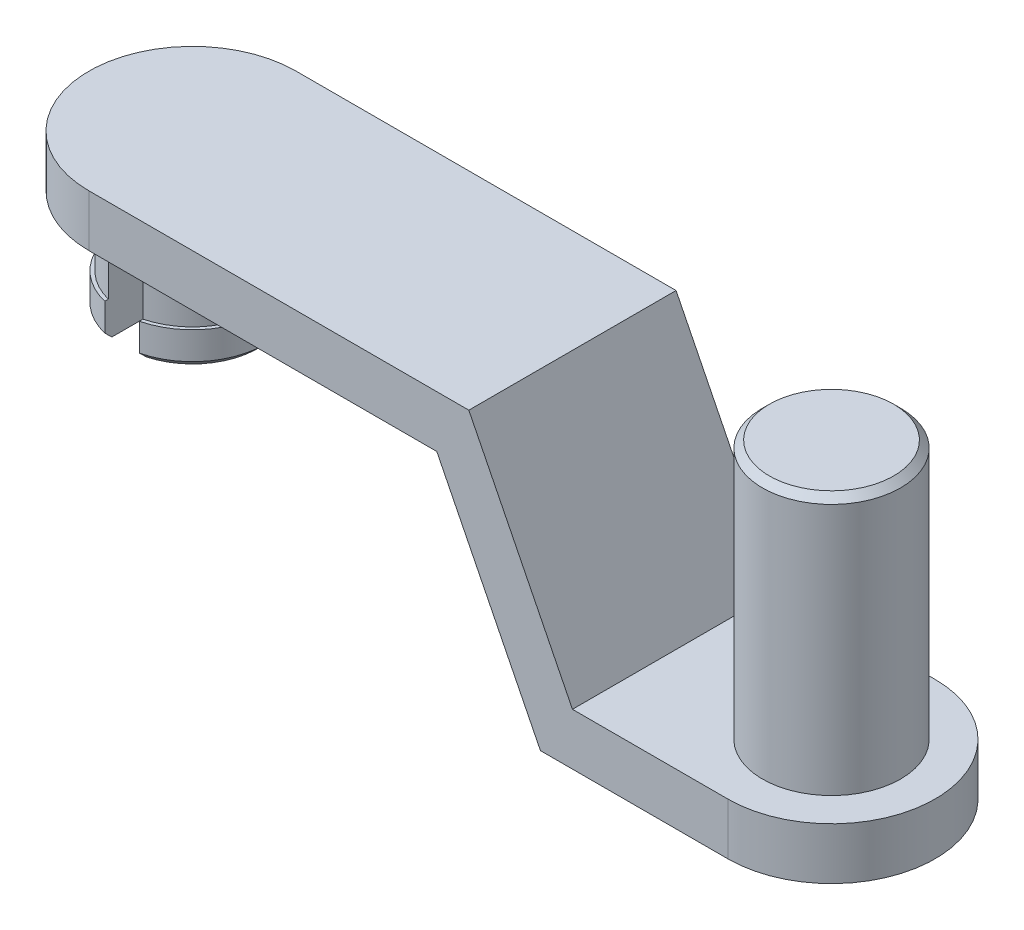
ISO-10303-21;
HEADER;
FILE_DESCRIPTION(('STEP AP214'),'2;1');
FILE_NAME('part.step','',(''),(''),'','','');
FILE_SCHEMA(('AUTOMOTIVE_DESIGN { 1 0 10303 214 1 1 1 1 }'));
ENDSEC;
DATA;
#1=APPLICATION_CONTEXT('core data for automotive mechanical design processes');
#2=APPLICATION_PROTOCOL_DEFINITION('international standard','automotive_design',2000,#1);
#3=PRODUCT_CONTEXT('',#1,'mechanical');
#4=PRODUCT('Part','Part','',(#3));
#5=PRODUCT_RELATED_PRODUCT_CATEGORY('part','',(#4));
#6=PRODUCT_DEFINITION_FORMATION('','',#4);
#7=PRODUCT_DEFINITION_CONTEXT('part definition',#1,'design');
#8=PRODUCT_DEFINITION('design','',#6,#7);
#9=PRODUCT_DEFINITION_SHAPE('','',#8);
#10=(LENGTH_UNIT() NAMED_UNIT(*) SI_UNIT(.MILLI.,.METRE.));
#11=(NAMED_UNIT(*) PLANE_ANGLE_UNIT() SI_UNIT($,.RADIAN.));
#12=(NAMED_UNIT(*) SI_UNIT($,.STERADIAN.) SOLID_ANGLE_UNIT());
#13=UNCERTAINTY_MEASURE_WITH_UNIT(LENGTH_MEASURE(1.E-05),#10,'distance_accuracy_value','');
#14=(GEOMETRIC_REPRESENTATION_CONTEXT(3) GLOBAL_UNCERTAINTY_ASSIGNED_CONTEXT((#13)) GLOBAL_UNIT_ASSIGNED_CONTEXT((#10,
#11,#12)) REPRESENTATION_CONTEXT('',''));
#15=CARTESIAN_POINT('',(0.,0.,0.));
#16=DIRECTION('',(0.,0.,1.));
#17=DIRECTION('',(1.,0.,0.));
#18=AXIS2_PLACEMENT_3D('',#15,#16,#17);
#19=CARTESIAN_POINT('',(14.,-6.,6.));
#20=DIRECTION('',(0.,-1.,0.));
#21=DIRECTION('',(1.,0.,0.));
#22=AXIS2_PLACEMENT_3D('',#19,#20,#21);
#23=PLANE('',#22);
#24=DIRECTION('',(-1.,0.,0.));
#25=VECTOR('',#24,1.);
#26=CARTESIAN_POINT('',(14.,-6.,6.));
#27=LINE('',#26,#25);
#28=CARTESIAN_POINT('',(18.5,-6.,6.));
#29=VERTEX_POINT('',#28);
#30=CARTESIAN_POINT('',(14.,-6.,6.));
#31=VERTEX_POINT('',#30);
#32=EDGE_CURVE('E110',#29,#31,#27,.T.);
#33=ORIENTED_EDGE('',*,*,#32,.F.);
#34=CARTESIAN_POINT('',(18.5,-6.,3.));
#35=DIRECTION('',(0.,1.,0.));
#36=DIRECTION('',(-1.,0.,0.));
#37=AXIS2_PLACEMENT_3D('',#34,#35,#36);
#38=CIRCLE('',#37,3.);
#39=CARTESIAN_POINT('',(18.5,-6.,0.));
#40=VERTEX_POINT('',#39);
#41=EDGE_CURVE('E331',#29,#40,#38,.T.);
#42=ORIENTED_EDGE('',*,*,#41,.T.);
#43=DIRECTION('',(-1.,0.,0.));
#44=VECTOR('',#43,1.);
#45=CARTESIAN_POINT('',(14.,-6.,0.));
#46=LINE('',#45,#44);
#47=CARTESIAN_POINT('',(14.,-6.,0.));
#48=VERTEX_POINT('',#47);
#49=EDGE_CURVE('E126',#40,#48,#46,.T.);
#50=ORIENTED_EDGE('',*,*,#49,.T.);
#51=DIRECTION('',(0.,0.,-1.));
#52=VECTOR('',#51,1.);
#53=CARTESIAN_POINT('',(14.,-6.,6.));
#54=LINE('',#53,#52);
#55=EDGE_CURVE('E123',#31,#48,#54,.T.);
#56=ORIENTED_EDGE('',*,*,#55,.F.);
#57=EDGE_LOOP('',(#33,#42,#50,#56));
#58=FACE_BOUND('',#57,.T.);
#59=CARTESIAN_POINT('',(18.5,-6.,3.));
#60=DIRECTION('',(0.,-1.,0.));
#61=DIRECTION('',(1.,0.,0.));
#62=AXIS2_PLACEMENT_3D('',#59,#60,#61);
#63=CIRCLE('',#62,2.);
#64=CARTESIAN_POINT('',(20.5,-6.,3.));
#65=VERTEX_POINT('',#64);
#66=EDGE_CURVE('E416',#65,#65,#63,.F.);
#67=ORIENTED_EDGE('',*,*,#66,.F.);
#68=EDGE_LOOP('',(#67));
#69=FACE_BOUND('',#68,.T.);
#70=ADVANCED_FACE('F34',(#58,#69),#23,.F.);
#71=CARTESIAN_POINT('',(0.,-3.5,3.));
#72=DIRECTION('',(0.,-1.,0.));
#73=DIRECTION('',(0.,0.,-1.));
#74=AXIS2_PLACEMENT_3D('',#71,#72,#73);
#75=PLANE('',#74);
#76=CARTESIAN_POINT('',(0.,-3.5,3.));
#77=DIRECTION('',(0.,-1.,0.));
#78=DIRECTION('',(0.,0.,-1.));
#79=AXIS2_PLACEMENT_3D('',#76,#77,#78);
#80=CIRCLE('',#79,2.1);
#81=CARTESIAN_POINT('',(0.5,-3.5,0.960392194562886));
#82=VERTEX_POINT('',#81);
#83=CARTESIAN_POINT('',(0.5,-3.5,5.03960780543711));
#84=VERTEX_POINT('',#83);
#85=EDGE_CURVE('E324',#82,#84,#80,.T.);
#86=ORIENTED_EDGE('',*,*,#85,.F.);
#87=DIRECTION('',(0.,0.,1.));
#88=VECTOR('',#87,1.);
#89=CARTESIAN_POINT('',(0.5,-3.5,3.));
#90=LINE('',#89,#88);
#91=CARTESIAN_POINT('',(0.5,-3.5,1.06350832689629));
#92=VERTEX_POINT('',#91);
#93=EDGE_CURVE('E315',#82,#92,#90,.T.);
#94=ORIENTED_EDGE('',*,*,#93,.T.);
#95=CARTESIAN_POINT('',(0.,-3.5,3.));
#96=DIRECTION('',(0.,-1.,0.));
#97=DIRECTION('',(0.,0.,-1.));
#98=AXIS2_PLACEMENT_3D('',#95,#96,#97);
#99=CIRCLE('',#98,2.);
#100=CARTESIAN_POINT('',(0.5,-3.5,4.93649167310371));
#101=VERTEX_POINT('',#100);
#102=EDGE_CURVE('E328',#92,#101,#99,.T.);
#103=ORIENTED_EDGE('',*,*,#102,.T.);
#104=EDGE_CURVE('E311',#101,#84,#90,.T.);
#105=ORIENTED_EDGE('',*,*,#104,.T.);
#106=EDGE_LOOP('',(#86,#94,#103,#105));
#107=FACE_BOUND('',#106,.T.);
#108=ADVANCED_FACE('F207',(#107),#75,.F.);
#109=CARTESIAN_POINT('',(0.,-4.5,3.));
#110=DIRECTION('',(0.,1.,0.));
#111=DIRECTION('',(0.,0.,1.));
#112=AXIS2_PLACEMENT_3D('',#109,#110,#111);
#113=CYLINDRICAL_SURFACE('',#112,2.1);
#114=CARTESIAN_POINT('',(0.,-4.3,3.));
#115=DIRECTION('',(0.,-1.,0.));
#116=DIRECTION('',(0.,0.,-1.));
#117=AXIS2_PLACEMENT_3D('',#114,#115,#116);
#118=CIRCLE('',#117,2.1);
#119=CARTESIAN_POINT('',(0.5,-4.3,5.03960780543711));
#120=VERTEX_POINT('',#119);
#121=CARTESIAN_POINT('',(0.5,-4.3,0.960392194562886));
#122=VERTEX_POINT('',#121);
#123=EDGE_CURVE('E168',#120,#122,#118,.F.);
#124=ORIENTED_EDGE('',*,*,#123,.T.);
#125=DIRECTION('',(0.,1.,0.));
#126=VECTOR('',#125,1.);
#127=CARTESIAN_POINT('',(0.5,-4.5,0.960392194562886));
#128=LINE('',#127,#126);
#129=EDGE_CURVE('E318',#122,#82,#128,.T.);
#130=ORIENTED_EDGE('',*,*,#129,.T.);
#131=ORIENTED_EDGE('',*,*,#85,.T.);
#132=DIRECTION('',(0.,1.,0.));
#133=VECTOR('',#132,1.);
#134=CARTESIAN_POINT('',(0.5,-4.5,5.03960780543711));
#135=LINE('',#134,#133);
#136=EDGE_CURVE('E308',#84,#120,#135,.F.);
#137=ORIENTED_EDGE('',*,*,#136,.T.);
#138=EDGE_LOOP('',(#124,#130,#131,#137));
#139=FACE_BOUND('',#138,.T.);
#140=ADVANCED_FACE('F211',(#139),#113,.T.);
#141=CARTESIAN_POINT('',(0.,-4.5,3.));
#142=DIRECTION('',(0.,-1.,0.));
#143=DIRECTION('',(0.,0.,-1.));
#144=AXIS2_PLACEMENT_3D('',#141,#142,#143);
#145=PLANE('',#144);
#146=DIRECTION('',(0.,0.,1.));
#147=VECTOR('',#146,1.);
#148=CARTESIAN_POINT('',(0.5,-4.5,5.5));
#149=LINE('',#148,#147);
#150=CARTESIAN_POINT('',(0.5,-4.5,1.16696972201766));
#151=VERTEX_POINT('',#150);
#152=CARTESIAN_POINT('',(0.5,-4.5,4.83303027798234));
#153=VERTEX_POINT('',#152);
#154=EDGE_CURVE('E299',#151,#153,#149,.T.);
#155=ORIENTED_EDGE('',*,*,#154,.F.);
#156=CARTESIAN_POINT('',(0.,-4.5,3.));
#157=DIRECTION('',(0.,-1.,0.));
#158=DIRECTION('',(0.,0.,-1.));
#159=AXIS2_PLACEMENT_3D('',#156,#157,#158);
#160=CIRCLE('',#159,1.9);
#161=EDGE_CURVE('E165',#151,#153,#160,.T.);
#162=ORIENTED_EDGE('',*,*,#161,.T.);
#163=EDGE_LOOP('',(#155,#162));
#164=FACE_BOUND('',#163,.T.);
#165=ADVANCED_FACE('F201',(#164),#145,.T.);
#166=CARTESIAN_POINT('',(0.,-4.5,3.));
#167=DIRECTION('',(0.,1.,0.));
#168=DIRECTION('',(0.,0.,1.));
#169=AXIS2_PLACEMENT_3D('',#166,#167,#168);
#170=CONICAL_SURFACE('',#169,1.9,0.785398163397446);
#171=CARTESIAN_POINT('',(0.500000000000001,-1.77694447500456,-1.59593759609405));
#172=CARTESIAN_POINT('',(0.500000000000001,-1.90725864942486,-1.464851596499));
#173=CARTESIAN_POINT('',(0.500000000000001,-2.03754284896405,-1.33373577582339));
#174=CARTESIAN_POINT('',(0.500000000000001,-2.29804470121487,-1.07139825790242));
#175=CARTESIAN_POINT('',(0.5,-2.42826234071689,-0.940176547540759));
#176=CARTESIAN_POINT('',(0.5,-2.68904147008711,-0.677160306255822));
#177=CARTESIAN_POINT('',(0.5,-2.8196025627187,-0.545365381309664));
#178=CARTESIAN_POINT('',(0.5,-3.08054503209228,-0.281637124747754));
#179=CARTESIAN_POINT('',(0.5,-3.21092643296967,-0.149703817005005));
#180=CARTESIAN_POINT('',(0.5,-3.52850486402094,0.172195926472496));
#181=CARTESIAN_POINT('',(0.5,-3.71558342952231,0.362279460615369));
#182=CARTESIAN_POINT('',(0.5,-3.99560379794718,0.648091252766742));
#183=CARTESIAN_POINT('',(0.5,-4.08886944410913,0.743502121435567));
#184=CARTESIAN_POINT('',(0.5,-4.27507790747899,0.934627554376544));
#185=CARTESIAN_POINT('',(0.5,-4.36802074378927,1.03034210001431));
#186=CARTESIAN_POINT('',(0.5,-4.55313085699641,1.22192993308691));
#187=CARTESIAN_POINT('',(0.5,-4.64529966114633,1.3178017442749));
#188=CARTESIAN_POINT('',(0.5,-4.82889767979174,1.51029609146025));
#189=CARTESIAN_POINT('',(0.5,-4.9203267212399,1.60691879330397));
#190=CARTESIAN_POINT('',(0.5,-5.05639094978187,1.75276953831258));
#191=CARTESIAN_POINT('',(0.5,-5.10154336893163,1.8015144931751));
#192=CARTESIAN_POINT('',(0.5,-5.19135742130123,1.89945387424127));
#193=CARTESIAN_POINT('',(0.5,-5.23601906525753,1.94864829056898));
#194=CARTESIAN_POINT('',(0.5,-5.32461063108871,2.04766027688098));
#195=CARTESIAN_POINT('',(0.5,-5.36854081566302,2.0974776113789));
#196=CARTESIAN_POINT('',(0.5,-5.45530168324035,2.19805811221833));
#197=CARTESIAN_POINT('',(0.5,-5.49813252655766,2.24882113876708));
#198=CARTESIAN_POINT('',(0.5,-5.55618205732116,2.32017718843945));
#199=CARTESIAN_POINT('',(0.5,-5.57218617843553,2.34012962066835));
#200=CARTESIAN_POINT('',(0.5,-5.60384526011566,2.38031034135259));
#201=CARTESIAN_POINT('',(0.5,-5.61950019910023,2.40053864673443));
#202=CARTESIAN_POINT('',(0.5,-5.6658889832682,2.46181798768515));
#203=CARTESIAN_POINT('',(0.5,-5.69597291801865,2.50337405505515));
#204=CARTESIAN_POINT('',(0.5,-5.75246381698921,2.58738259633054));
#205=CARTESIAN_POINT('',(0.5,-5.77894556195368,2.62978436740456));
#206=CARTESIAN_POINT('',(0.5,-5.82680483126478,2.7173510555543));
#207=CARTESIAN_POINT('',(0.5,-5.84820543735425,2.76250225933257));
#208=CARTESIAN_POINT('',(0.5,-5.87012186553057,2.82405652688668));
#209=CARTESIAN_POINT('',(0.5,-5.87489242751715,2.83892820911021));
#210=CARTESIAN_POINT('',(0.5,-5.8833227068488,2.86898326513388));
#211=CARTESIAN_POINT('',(0.5,-5.88698231535096,2.88416666931873));
#212=CARTESIAN_POINT('',(0.5,-5.89599335813248,2.9299569556103));
#213=CARTESIAN_POINT('',(0.5,-5.89944295183507,2.96097825626507));
#214=CARTESIAN_POINT('',(0.5,-5.90043282602035,3.02325858712015));
#215=CARTESIAN_POINT('',(0.5,-5.89794497284037,3.05451804674608));
#216=CARTESIAN_POINT('',(0.5,-5.88758370676067,3.11622197233717));
#217=CARTESIAN_POINT('',(0.5,-5.87968532181561,3.14666197618197));
#218=CARTESIAN_POINT('',(0.5,-5.85947605506013,3.20742900671426));
#219=CARTESIAN_POINT('',(0.5,-5.84699034780231,3.23769511672575));
#220=CARTESIAN_POINT('',(0.5,-5.81909532647068,3.29687172269765));
#221=CARTESIAN_POINT('',(0.5,-5.80368063821963,3.3257796029848));
#222=CARTESIAN_POINT('',(0.5,-5.7708010340626,3.38266601200051));
#223=CARTESIAN_POINT('',(0.5,-5.75332196393389,3.41063620928982));
#224=CARTESIAN_POINT('',(0.5,-5.71705157511045,3.46566655364365));
#225=CARTESIAN_POINT('',(0.5,-5.69826141348433,3.49272747268127));
#226=CARTESIAN_POINT('',(0.5,-5.65804211235671,3.54855166935265));
#227=CARTESIAN_POINT('',(0.5,-5.63652685937345,3.57725246701966));
#228=CARTESIAN_POINT('',(0.5,-5.59271877202337,3.63405644744494));
#229=CARTESIAN_POINT('',(0.5,-5.57042583323179,3.66215954912497));
#230=CARTESIAN_POINT('',(0.5,-5.50269174541035,3.74581865170284));
#231=CARTESIAN_POINT('',(0.5,-5.45641595954386,3.80069677559796));
#232=CARTESIAN_POINT('',(0.5,-5.36252218315223,3.90945118236382));
#233=CARTESIAN_POINT('',(0.5,-5.31490192241674,3.9633254798543));
#234=CARTESIAN_POINT('',(0.5,-5.2188718936665,4.07033651702215));
#235=CARTESIAN_POINT('',(0.5,-5.17046235701997,4.12347346468248));
#236=CARTESIAN_POINT('',(0.5,-5.0732426930014,4.22910892167987));
#237=CARTESIAN_POINT('',(0.5,-5.02443402954613,4.28160878289635));
#238=CARTESIAN_POINT('',(0.5,-4.9264383160272,4.3862608524179));
#239=CARTESIAN_POINT('',(0.5,-4.87725123888416,4.43841303533508));
#240=CARTESIAN_POINT('',(0.5,-4.72939189915107,4.59437647595472));
#241=CARTESIAN_POINT('',(0.5,-4.63031777076812,4.69780635877258));
#242=CARTESIAN_POINT('',(0.5,-4.41738044422751,4.91879164879537));
#243=CARTESIAN_POINT('',(0.5,-4.30342401697876,5.03625694266263));
#244=CARTESIAN_POINT('',(0.5,-4.0750304716396,5.27072166295406));
#245=CARTESIAN_POINT('',(0.5,-3.96059334765461,5.38772108363097));
#246=CARTESIAN_POINT('',(0.5,-3.61672922432487,5.73838059482994));
#247=CARTESIAN_POINT('',(0.5,-3.3868507515411,5.97159758582109));
#248=CARTESIAN_POINT('',(0.5,-2.92709436536031,6.43690521394123));
#249=CARTESIAN_POINT('',(0.5,-2.69721782538564,6.66899721082122));
#250=CARTESIAN_POINT('',(0.5,-2.2372306876253,7.13272697501965));
#251=CARTESIAN_POINT('',(0.5,-2.00712025644904,7.36436490755207));
#252=CARTESIAN_POINT('',(0.5,-1.77694447500456,7.59593759609405));
#253=B_SPLINE_CURVE_WITH_KNOTS('',3,(#171,#172,#173,#174,#175,#176,#177,#178,#179,#180,#181,
#182,#183,#184,#185,#186,#187,#188,#189,#190,#191,#192,#193,#194,#195,#196,#197,#198,#199,#200,
#201,#202,#203,#204,#205,#206,#207,#208,#209,#210,#211,#212,#213,#214,#215,#216,#217,#218,#219,
#220,#221,#222,#223,#224,#225,#226,#227,#228,#229,#230,#231,#232,#233,#234,#235,#236,#237,#238,
#239,#240,#241,#242,#243,#244,#245,#246,#247,#248,#249,#250,#251,#252),.UNSPECIFIED.,.F.,.F.,(4,
2,2,2,2,2,2,2,2,2,2,2,2,2,2,2,2,2,2,2,2,2,2,2,2,2,2,2,2,2,2,2,2,2,2,2,2,2,2,2,4),(0.,
0.554515939331894,1.10911660558443,1.66566378116448,2.22212701638154,3.0222321266636,
3.42250090560791,3.82274558057608,4.2217156302623,4.62077645604252,4.82010649708293,
5.01943216875989,5.21868463861977,5.41790788496151,5.49463787564888,5.57137259556364,
5.72518978470532,5.8750428342509,6.02420154333957,6.07101658149991,6.11783620476835,
6.21092256997829,6.30445088540068,6.39841381074601,6.49640939601994,6.59458655365546,
6.69348088919279,6.7922890259109,6.89987966505137,7.00748480709445,7.22279856195819,
7.4385006464328,7.65414059806628,7.86918877073308,8.08425247815543,8.51392248262084,
9.00489670869725,9.4958769730592,10.4782737434732,11.4582680547407,12.4377891752635),.UNSPECIFIED.);
#254=EDGE_CURVE('E398',#122,#151,#253,.T.);
#255=ORIENTED_EDGE('',*,*,#254,.F.);
#256=ORIENTED_EDGE('',*,*,#123,.F.);
#257=EDGE_CURVE('E179',#153,#120,#253,.T.);
#258=ORIENTED_EDGE('',*,*,#257,.F.);
#259=ORIENTED_EDGE('',*,*,#161,.F.);
#260=EDGE_LOOP('',(#255,#256,#258,#259));
#261=FACE_BOUND('',#260,.T.);
#262=ADVANCED_FACE('F245',(#261),#170,.T.);
#263=CARTESIAN_POINT('',(0.,-1.5,6.));
#264=DIRECTION('',(0.,1.,0.));
#265=DIRECTION('',(0.,0.,1.));
#266=AXIS2_PLACEMENT_3D('',#263,#264,#265);
#267=PLANE('',#266);
#268=DIRECTION('',(1.,0.,0.));
#269=VECTOR('',#268,1.);
#270=CARTESIAN_POINT('',(0.,-1.5,6.));
#271=LINE('',#270,#269);
#272=CARTESIAN_POINT('',(0.,-1.5,6.));
#273=VERTEX_POINT('',#272);
#274=CARTESIAN_POINT('',(10.0729490168752,-1.5,6.));
#275=VERTEX_POINT('',#274);
#276=EDGE_CURVE('E95',#273,#275,#271,.T.);
#277=ORIENTED_EDGE('',*,*,#276,.F.);
#278=CARTESIAN_POINT('',(0.,-1.5,3.));
#279=DIRECTION('',(0.,1.,0.));
#280=DIRECTION('',(0.,0.,1.));
#281=AXIS2_PLACEMENT_3D('',#278,#279,#280);
#282=CIRCLE('',#281,3.);
#283=CARTESIAN_POINT('',(0.,-1.5,0.));
#284=VERTEX_POINT('',#283);
#285=EDGE_CURVE('E141',#284,#273,#282,.T.);
#286=ORIENTED_EDGE('',*,*,#285,.F.);
#287=DIRECTION('',(1.,0.,0.));
#288=VECTOR('',#287,1.);
#289=CARTESIAN_POINT('',(0.,-1.5,0.));
#290=LINE('',#289,#288);
#291=CARTESIAN_POINT('',(10.0729490168752,-1.5,0.));
#292=VERTEX_POINT('',#291);
#293=EDGE_CURVE('E140',#284,#292,#290,.T.);
#294=ORIENTED_EDGE('',*,*,#293,.T.);
#295=DIRECTION('',(0.,0.,-1.));
#296=VECTOR('',#295,1.);
#297=CARTESIAN_POINT('',(10.0729490168752,-1.5,6.));
#298=LINE('',#297,#296);
#299=EDGE_CURVE('E158',#275,#292,#298,.T.);
#300=ORIENTED_EDGE('',*,*,#299,.F.);
#301=EDGE_LOOP('',(#277,#286,#294,#300));
#302=FACE_BOUND('',#301,.T.);
#303=CARTESIAN_POINT('',(0.,-1.5,3.));
#304=DIRECTION('',(0.,1.,0.));
#305=DIRECTION('',(0.,0.,1.));
#306=AXIS2_PLACEMENT_3D('',#303,#304,#305);
#307=CIRCLE('',#306,2.);
#308=CARTESIAN_POINT('',(0.,-1.5,5.));
#309=VERTEX_POINT('',#308);
#310=EDGE_CURVE('E161',#309,#309,#307,.F.);
#311=ORIENTED_EDGE('',*,*,#310,.F.);
#312=EDGE_LOOP('',(#311));
#313=FACE_BOUND('',#312,.T.);
#314=ADVANCED_FACE('F242',(#302,#313),#267,.F.);
#315=CARTESIAN_POINT('',(10.0729490168752,-1.5,6.));
#316=DIRECTION('',(0.894427190999916,0.447213595499958,0.));
#317=DIRECTION('',(-0.447213595499958,0.894427190999916,0.));
#318=AXIS2_PLACEMENT_3D('',#315,#316,#317);
#319=PLANE('',#318);
#320=DIRECTION('',(0.447213595499958,-0.894427190999916,0.));
#321=VECTOR('',#320,1.);
#322=CARTESIAN_POINT('',(10.0729490168752,-1.5,0.));
#323=LINE('',#322,#321);
#324=CARTESIAN_POINT('',(13.0729490168752,-7.5,0.));
#325=VERTEX_POINT('',#324);
#326=EDGE_CURVE('E143',#292,#325,#323,.T.);
#327=ORIENTED_EDGE('',*,*,#326,.T.);
#328=DIRECTION('',(0.,0.,-1.));
#329=VECTOR('',#328,1.);
#330=CARTESIAN_POINT('',(13.0729490168752,-7.5,6.));
#331=LINE('',#330,#329);
#332=CARTESIAN_POINT('',(13.0729490168752,-7.5,6.));
#333=VERTEX_POINT('',#332);
#334=EDGE_CURVE('E129',#333,#325,#331,.T.);
#335=ORIENTED_EDGE('',*,*,#334,.F.);
#336=DIRECTION('',(0.447213595499958,-0.894427190999916,0.));
#337=VECTOR('',#336,1.);
#338=CARTESIAN_POINT('',(10.0729490168752,-1.5,6.));
#339=LINE('',#338,#337);
#340=EDGE_CURVE('E342',#275,#333,#339,.T.);
#341=ORIENTED_EDGE('',*,*,#340,.F.);
#342=ORIENTED_EDGE('',*,*,#299,.T.);
#343=EDGE_LOOP('',(#327,#335,#341,#342));
#344=FACE_BOUND('',#343,.T.);
#345=ADVANCED_FACE('F239',(#344),#319,.F.);
#346=CARTESIAN_POINT('',(13.0729490168752,-7.5,6.));
#347=DIRECTION('',(0.,1.,0.));
#348=DIRECTION('',(0.,0.,1.));
#349=AXIS2_PLACEMENT_3D('',#346,#347,#348);
#350=PLANE('',#349);
#351=DIRECTION('',(1.,0.,0.));
#352=VECTOR('',#351,1.);
#353=CARTESIAN_POINT('',(13.0729490168752,-7.5,0.));
#354=LINE('',#353,#352);
#355=CARTESIAN_POINT('',(18.5,-7.5,0.));
#356=VERTEX_POINT('',#355);
#357=EDGE_CURVE('E145',#325,#356,#354,.T.);
#358=ORIENTED_EDGE('',*,*,#357,.T.);
#359=CARTESIAN_POINT('',(18.5,-7.5,3.));
#360=DIRECTION('',(0.,1.,0.));
#361=DIRECTION('',(-1.,0.,0.));
#362=AXIS2_PLACEMENT_3D('',#359,#360,#361);
#363=CIRCLE('',#362,3.);
#364=CARTESIAN_POINT('',(18.5,-7.5,6.));
#365=VERTEX_POINT('',#364);
#366=EDGE_CURVE('E332',#365,#356,#363,.T.);
#367=ORIENTED_EDGE('',*,*,#366,.F.);
#368=DIRECTION('',(1.,0.,0.));
#369=VECTOR('',#368,1.);
#370=CARTESIAN_POINT('',(13.0729490168752,-7.5,6.));
#371=LINE('',#370,#369);
#372=EDGE_CURVE('E344',#333,#365,#371,.T.);
#373=ORIENTED_EDGE('',*,*,#372,.F.);
#374=ORIENTED_EDGE('',*,*,#334,.T.);
#375=EDGE_LOOP('',(#358,#367,#373,#374));
#376=FACE_BOUND('',#375,.T.);
#377=ADVANCED_FACE('F234',(#376),#350,.F.);
#378=CARTESIAN_POINT('',(11.,0.,6.));
#379=DIRECTION('',(-0.894427190999916,-0.447213595499958,0.));
#380=DIRECTION('',(0.447213595499958,-0.894427190999916,0.));
#381=AXIS2_PLACEMENT_3D('',#378,#379,#380);
#382=PLANE('',#381);
#383=DIRECTION('',(-0.447213595499958,0.894427190999916,0.));
#384=VECTOR('',#383,1.);
#385=CARTESIAN_POINT('',(11.,0.,0.));
#386=LINE('',#385,#384);
#387=CARTESIAN_POINT('',(11.,0.,0.));
#388=VERTEX_POINT('',#387);
#389=EDGE_CURVE('E151',#48,#388,#386,.T.);
#390=ORIENTED_EDGE('',*,*,#389,.T.);
#391=DIRECTION('',(0.,0.,-1.));
#392=VECTOR('',#391,1.);
#393=CARTESIAN_POINT('',(11.,0.,6.));
#394=LINE('',#393,#392);
#395=CARTESIAN_POINT('',(11.,0.,6.));
#396=VERTEX_POINT('',#395);
#397=EDGE_CURVE('E130',#396,#388,#394,.T.);
#398=ORIENTED_EDGE('',*,*,#397,.F.);
#399=DIRECTION('',(-0.447213595499958,0.894427190999916,0.));
#400=VECTOR('',#399,1.);
#401=CARTESIAN_POINT('',(11.,0.,6.));
#402=LINE('',#401,#400);
#403=EDGE_CURVE('E114',#31,#396,#402,.T.);
#404=ORIENTED_EDGE('',*,*,#403,.F.);
#405=ORIENTED_EDGE('',*,*,#55,.T.);
#406=EDGE_LOOP('',(#390,#398,#404,#405));
#407=FACE_BOUND('',#406,.T.);
#408=ADVANCED_FACE('F132',(#407),#382,.F.);
#409=CARTESIAN_POINT('',(0.,0.,6.));
#410=DIRECTION('',(0.,-1.,0.));
#411=DIRECTION('',(0.,0.,-1.));
#412=AXIS2_PLACEMENT_3D('',#409,#410,#411);
#413=PLANE('',#412);
#414=DIRECTION('',(-1.,0.,0.));
#415=VECTOR('',#414,1.);
#416=CARTESIAN_POINT('',(0.,0.,0.));
#417=LINE('',#416,#415);
#418=CARTESIAN_POINT('',(0.,0.,0.));
#419=VERTEX_POINT('',#418);
#420=EDGE_CURVE('E86',#388,#419,#417,.T.);
#421=ORIENTED_EDGE('',*,*,#420,.T.);
#422=CARTESIAN_POINT('',(0.,0.,3.));
#423=DIRECTION('',(0.,1.,0.));
#424=DIRECTION('',(0.,0.,1.));
#425=AXIS2_PLACEMENT_3D('',#422,#423,#424);
#426=CIRCLE('',#425,3.);
#427=CARTESIAN_POINT('',(0.,0.,6.));
#428=VERTEX_POINT('',#427);
#429=EDGE_CURVE('E335',#419,#428,#426,.T.);
#430=ORIENTED_EDGE('',*,*,#429,.T.);
#431=DIRECTION('',(-1.,0.,0.));
#432=VECTOR('',#431,1.);
#433=CARTESIAN_POINT('',(0.,0.,6.));
#434=LINE('',#433,#432);
#435=EDGE_CURVE('E58',#396,#428,#434,.T.);
#436=ORIENTED_EDGE('',*,*,#435,.F.);
#437=ORIENTED_EDGE('',*,*,#397,.T.);
#438=EDGE_LOOP('',(#421,#430,#436,#437));
#439=FACE_BOUND('',#438,.T.);
#440=ADVANCED_FACE('F226',(#439),#413,.F.);
#441=CARTESIAN_POINT('',(0.,0.,6.));
#442=DIRECTION('',(0.,0.,1.));
#443=DIRECTION('',(1.,0.,0.));
#444=AXIS2_PLACEMENT_3D('',#441,#442,#443);
#445=PLANE('',#444);
#446=DIRECTION('',(0.,-1.,0.));
#447=VECTOR('',#446,1.);
#448=CARTESIAN_POINT('',(0.,0.,6.));
#449=LINE('',#448,#447);
#450=EDGE_CURVE('E154',#428,#273,#449,.T.);
#451=ORIENTED_EDGE('',*,*,#450,.T.);
#452=ORIENTED_EDGE('',*,*,#276,.T.);
#453=ORIENTED_EDGE('',*,*,#340,.T.);
#454=ORIENTED_EDGE('',*,*,#372,.T.);
#455=DIRECTION('',(0.,1.,0.));
#456=VECTOR('',#455,1.);
#457=CARTESIAN_POINT('',(18.5,-6.,6.));
#458=LINE('',#457,#456);
#459=EDGE_CURVE('E117',#365,#29,#458,.T.);
#460=ORIENTED_EDGE('',*,*,#459,.T.);
#461=ORIENTED_EDGE('',*,*,#32,.T.);
#462=ORIENTED_EDGE('',*,*,#403,.T.);
#463=ORIENTED_EDGE('',*,*,#435,.T.);
#464=EDGE_LOOP('',(#451,#452,#453,#454,#460,#461,#462,#463));
#465=FACE_BOUND('',#464,.T.);
#466=ADVANCED_FACE('F112',(#465),#445,.T.);
#467=CARTESIAN_POINT('',(0.,0.,0.));
#468=DIRECTION('',(0.,0.,1.));
#469=DIRECTION('',(1.,0.,0.));
#470=AXIS2_PLACEMENT_3D('',#467,#468,#469);
#471=PLANE('',#470);
#472=DIRECTION('',(0.,-1.,0.));
#473=VECTOR('',#472,1.);
#474=CARTESIAN_POINT('',(0.,0.,0.));
#475=LINE('',#474,#473);
#476=EDGE_CURVE('E137',#419,#284,#475,.T.);
#477=ORIENTED_EDGE('',*,*,#476,.F.);
#478=ORIENTED_EDGE('',*,*,#420,.F.);
#479=ORIENTED_EDGE('',*,*,#389,.F.);
#480=ORIENTED_EDGE('',*,*,#49,.F.);
#481=DIRECTION('',(0.,1.,0.));
#482=VECTOR('',#481,1.);
#483=CARTESIAN_POINT('',(18.5,-6.,0.));
#484=LINE('',#483,#482);
#485=EDGE_CURVE('E147',#356,#40,#484,.T.);
#486=ORIENTED_EDGE('',*,*,#485,.F.);
#487=ORIENTED_EDGE('',*,*,#357,.F.);
#488=ORIENTED_EDGE('',*,*,#326,.F.);
#489=ORIENTED_EDGE('',*,*,#293,.F.);
#490=EDGE_LOOP('',(#477,#478,#479,#480,#486,#487,#488,#489));
#491=FACE_BOUND('',#490,.T.);
#492=ADVANCED_FACE('F222',(#491),#471,.F.);
#493=CARTESIAN_POINT('',(0.,-1.5,3.));
#494=DIRECTION('',(0.,1.,0.));
#495=DIRECTION('',(0.,0.,1.));
#496=AXIS2_PLACEMENT_3D('',#493,#494,#495);
#497=CYLINDRICAL_SURFACE('',#496,3.);
#498=ORIENTED_EDGE('',*,*,#285,.T.);
#499=ORIENTED_EDGE('',*,*,#450,.F.);
#500=ORIENTED_EDGE('',*,*,#429,.F.);
#501=ORIENTED_EDGE('',*,*,#476,.T.);
#502=EDGE_LOOP('',(#498,#499,#500,#501));
#503=FACE_BOUND('',#502,.T.);
#504=ADVANCED_FACE('F218',(#503),#497,.T.);
#505=CARTESIAN_POINT('',(18.5,-7.5,3.));
#506=DIRECTION('',(0.,1.,0.));
#507=DIRECTION('',(-1.,0.,0.));
#508=AXIS2_PLACEMENT_3D('',#505,#506,#507);
#509=CYLINDRICAL_SURFACE('',#508,3.);
#510=ORIENTED_EDGE('',*,*,#459,.F.);
#511=ORIENTED_EDGE('',*,*,#366,.T.);
#512=ORIENTED_EDGE('',*,*,#485,.T.);
#513=ORIENTED_EDGE('',*,*,#41,.F.);
#514=EDGE_LOOP('',(#510,#511,#512,#513));
#515=FACE_BOUND('',#514,.T.);
#516=ADVANCED_FACE('F214',(#515),#509,.T.);
#517=CARTESIAN_POINT('',(0.,-3.5,3.));
#518=DIRECTION('',(0.,1.,0.));
#519=DIRECTION('',(0.,0.,1.));
#520=AXIS2_PLACEMENT_3D('',#517,#518,#519);
#521=CYLINDRICAL_SURFACE('',#520,2.);
#522=CARTESIAN_POINT('',(0.,-2.5,3.));
#523=DIRECTION('',(0.,-1.,0.));
#524=DIRECTION('',(0.,0.,-1.));
#525=AXIS2_PLACEMENT_3D('',#522,#523,#524);
#526=CIRCLE('',#525,2.);
#527=CARTESIAN_POINT('',(0.5,-2.5,4.93649167310371));
#528=VERTEX_POINT('',#527);
#529=CARTESIAN_POINT('',(-0.5,-2.5,4.93649167310371));
#530=VERTEX_POINT('',#529);
#531=EDGE_CURVE('E412',#528,#530,#526,.T.);
#532=ORIENTED_EDGE('',*,*,#531,.F.);
#533=DIRECTION('',(0.,1.,0.));
#534=VECTOR('',#533,1.);
#535=CARTESIAN_POINT('',(0.5,-3.5,4.93649167310371));
#536=LINE('',#535,#534);
#537=EDGE_CURVE('E314',#528,#101,#536,.F.);
#538=ORIENTED_EDGE('',*,*,#537,.T.);
#539=ORIENTED_EDGE('',*,*,#102,.F.);
#540=DIRECTION('',(0.,1.,0.));
#541=VECTOR('',#540,1.);
#542=CARTESIAN_POINT('',(0.5,-3.5,1.06350832689629));
#543=LINE('',#542,#541);
#544=CARTESIAN_POINT('',(0.5,-2.5,1.06350832689629));
#545=VERTEX_POINT('',#544);
#546=EDGE_CURVE('E321',#92,#545,#543,.T.);
#547=ORIENTED_EDGE('',*,*,#546,.T.);
#548=CARTESIAN_POINT('',(-0.5,-2.5,1.06350832689629));
#549=VERTEX_POINT('',#548);
#550=EDGE_CURVE('E404',#549,#545,#526,.T.);
#551=ORIENTED_EDGE('',*,*,#550,.F.);
#552=DIRECTION('',(0.,1.,0.));
#553=VECTOR('',#552,1.);
#554=CARTESIAN_POINT('',(-0.5,-3.5,1.06350832689629));
#555=LINE('',#554,#553);
#556=CARTESIAN_POINT('',(-0.5,-3.5,1.06350832689629));
#557=VERTEX_POINT('',#556);
#558=EDGE_CURVE('E292',#549,#557,#555,.F.);
#559=ORIENTED_EDGE('',*,*,#558,.T.);
#560=CARTESIAN_POINT('',(-0.5,-3.5,4.93649167310371));
#561=VERTEX_POINT('',#560);
#562=EDGE_CURVE('E327',#561,#557,#99,.T.);
#563=ORIENTED_EDGE('',*,*,#562,.F.);
#564=DIRECTION('',(0.,1.,0.));
#565=VECTOR('',#564,1.);
#566=CARTESIAN_POINT('',(-0.5,-3.5,4.93649167310371));
#567=LINE('',#566,#565);
#568=EDGE_CURVE('E305',#561,#530,#567,.T.);
#569=ORIENTED_EDGE('',*,*,#568,.T.);
#570=EDGE_LOOP('',(#532,#538,#539,#547,#551,#559,#563,#569));
#571=FACE_BOUND('',#570,.T.);
#572=ORIENTED_EDGE('',*,*,#310,.T.);
#573=EDGE_LOOP('',(#572));
#574=FACE_BOUND('',#573,.T.);
#575=ADVANCED_FACE('F205',(#571,#574),#521,.T.);
#576=CARTESIAN_POINT('',(-0.5,-3.5,5.03960780543711));
#577=VERTEX_POINT('',#576);
#578=CARTESIAN_POINT('',(-0.5,-3.5,0.960392194562886));
#579=VERTEX_POINT('',#578);
#580=EDGE_CURVE('E284',#577,#579,#80,.T.);
#581=ORIENTED_EDGE('',*,*,#580,.F.);
#582=DIRECTION('',(0.,0.,-1.));
#583=VECTOR('',#582,1.);
#584=CARTESIAN_POINT('',(-0.5,-3.5,3.));
#585=LINE('',#584,#583);
#586=EDGE_CURVE('E294',#577,#561,#585,.T.);
#587=ORIENTED_EDGE('',*,*,#586,.T.);
#588=ORIENTED_EDGE('',*,*,#562,.T.);
#589=EDGE_CURVE('E289',#557,#579,#585,.T.);
#590=ORIENTED_EDGE('',*,*,#589,.T.);
#591=EDGE_LOOP('',(#581,#587,#588,#590));
#592=FACE_BOUND('',#591,.T.);
#593=ADVANCED_FACE('F202',(#592),#75,.F.);
#594=CARTESIAN_POINT('',(-0.5,-4.3,0.960392194562886));
#595=VERTEX_POINT('',#594);
#596=CARTESIAN_POINT('',(-0.5,-4.3,5.03960780543711));
#597=VERTEX_POINT('',#596);
#598=EDGE_CURVE('E169',#595,#597,#118,.F.);
#599=ORIENTED_EDGE('',*,*,#598,.T.);
#600=DIRECTION('',(0.,1.,0.));
#601=VECTOR('',#600,1.);
#602=CARTESIAN_POINT('',(-0.5,-4.5,5.03960780543711));
#603=LINE('',#602,#601);
#604=EDGE_CURVE('E279',#597,#577,#603,.T.);
#605=ORIENTED_EDGE('',*,*,#604,.T.);
#606=ORIENTED_EDGE('',*,*,#580,.T.);
#607=DIRECTION('',(0.,1.,0.));
#608=VECTOR('',#607,1.);
#609=CARTESIAN_POINT('',(-0.5,-4.5,0.960392194562886));
#610=LINE('',#609,#608);
#611=EDGE_CURVE('E282',#579,#595,#610,.F.);
#612=ORIENTED_EDGE('',*,*,#611,.T.);
#613=EDGE_LOOP('',(#599,#605,#606,#612));
#614=FACE_BOUND('',#613,.T.);
#615=ADVANCED_FACE('F199',(#614),#113,.T.);
#616=DIRECTION('',(0.,0.,-1.));
#617=VECTOR('',#616,1.);
#618=CARTESIAN_POINT('',(-0.5,-4.5,5.5));
#619=LINE('',#618,#617);
#620=CARTESIAN_POINT('',(-0.5,-4.5,4.83303027798234));
#621=VERTEX_POINT('',#620);
#622=CARTESIAN_POINT('',(-0.5,-4.5,1.16696972201766));
#623=VERTEX_POINT('',#622);
#624=EDGE_CURVE('E49',#621,#623,#619,.T.);
#625=ORIENTED_EDGE('',*,*,#624,.F.);
#626=EDGE_CURVE('E164',#621,#623,#160,.T.);
#627=ORIENTED_EDGE('',*,*,#626,.T.);
#628=EDGE_LOOP('',(#625,#627));
#629=FACE_BOUND('',#628,.T.);
#630=ADVANCED_FACE('F196',(#629),#145,.T.);
#631=CARTESIAN_POINT('',(-0.500000000000001,-1.77694447500457,7.59593759609405));
#632=CARTESIAN_POINT('',(-0.5,-1.90725864942486,7.46485159649899));
#633=CARTESIAN_POINT('',(-0.5,-2.03754284896406,7.33373577582339));
#634=CARTESIAN_POINT('',(-0.5,-2.29804470121488,7.07139825790241));
#635=CARTESIAN_POINT('',(-0.5,-2.4282623407169,6.94017654754075));
#636=CARTESIAN_POINT('',(-0.5,-2.68904147008713,6.67716030625581));
#637=CARTESIAN_POINT('',(-0.5,-2.81960256271872,6.54536538130965));
#638=CARTESIAN_POINT('',(-0.5,-3.0805450320923,6.28163712474773));
#639=CARTESIAN_POINT('',(-0.5,-3.2109264329697,6.14970381700498));
#640=CARTESIAN_POINT('',(-0.5,-3.52850486402096,5.82780407352748));
#641=CARTESIAN_POINT('',(-0.5,-3.71558342952233,5.63772053938461));
#642=CARTESIAN_POINT('',(-0.5,-3.99560379794719,5.35190874723324));
#643=CARTESIAN_POINT('',(-0.5,-4.08886944410914,5.25649787856442));
#644=CARTESIAN_POINT('',(-0.5,-4.275077907479,5.06537244562344));
#645=CARTESIAN_POINT('',(-0.5,-4.36802074378929,4.96965789998568));
#646=CARTESIAN_POINT('',(-0.5,-4.55313085699642,4.77807006691308));
#647=CARTESIAN_POINT('',(-0.5,-4.64529966114634,4.68219825572509));
#648=CARTESIAN_POINT('',(-0.5,-4.82889767979175,4.48970390853975));
#649=CARTESIAN_POINT('',(-0.5,-4.9203267212399,4.39308120669602));
#650=CARTESIAN_POINT('',(-0.5,-5.05639094978188,4.24723046168741));
#651=CARTESIAN_POINT('',(-0.5,-5.10154336893163,4.1984855068249));
#652=CARTESIAN_POINT('',(-0.5,-5.19135742130123,4.10054612575873));
#653=CARTESIAN_POINT('',(-0.5,-5.23601906525754,4.05135170943102));
#654=CARTESIAN_POINT('',(-0.5,-5.32461063108872,3.95233972311901));
#655=CARTESIAN_POINT('',(-0.5,-5.36854081566302,3.9025223886211));
#656=CARTESIAN_POINT('',(-0.5,-5.45530168324036,3.80194188778167));
#657=CARTESIAN_POINT('',(-0.5,-5.49813252655767,3.75117886123292));
#658=CARTESIAN_POINT('',(-0.5,-5.55618205732116,3.67982281156055));
#659=CARTESIAN_POINT('',(-0.5,-5.57218617843553,3.65987037933165));
#660=CARTESIAN_POINT('',(-0.5,-5.60384526011566,3.61968965864741));
#661=CARTESIAN_POINT('',(-0.5,-5.61950019910023,3.59946135326557));
#662=CARTESIAN_POINT('',(-0.5,-5.6658889832682,3.53818201231485));
#663=CARTESIAN_POINT('',(-0.5,-5.69597291801865,3.49662594494485));
#664=CARTESIAN_POINT('',(-0.5,-5.75246381698921,3.41261740366946));
#665=CARTESIAN_POINT('',(-0.5,-5.77894556195368,3.37021563259544));
#666=CARTESIAN_POINT('',(-0.5,-5.82680483126478,3.2826489444457));
#667=CARTESIAN_POINT('',(-0.5,-5.84820543735424,3.23749774066742));
#668=CARTESIAN_POINT('',(-0.5,-5.87012186553057,3.17594347311332));
#669=CARTESIAN_POINT('',(-0.5,-5.87489242751715,3.16107179088979));
#670=CARTESIAN_POINT('',(-0.5,-5.8833227068488,3.13101673486612));
#671=CARTESIAN_POINT('',(-0.5,-5.88698231535096,3.11583333068127));
#672=CARTESIAN_POINT('',(-0.5,-5.89599335813248,3.0700430443897));
#673=CARTESIAN_POINT('',(-0.5,-5.89944295183507,3.03902174373493));
#674=CARTESIAN_POINT('',(-0.5,-5.90043282602035,2.97674141287985));
#675=CARTESIAN_POINT('',(-0.5,-5.89794497284037,2.94548195325392));
#676=CARTESIAN_POINT('',(-0.5,-5.88758370676067,2.88377802766283));
#677=CARTESIAN_POINT('',(-0.5,-5.87968532181561,2.85333802381803));
#678=CARTESIAN_POINT('',(-0.5,-5.85947605506013,2.79257099328574));
#679=CARTESIAN_POINT('',(-0.5,-5.84699034780231,2.76230488327425));
#680=CARTESIAN_POINT('',(-0.5,-5.81909532647068,2.70312827730235));
#681=CARTESIAN_POINT('',(-0.5,-5.80368063821963,2.67422039701519));
#682=CARTESIAN_POINT('',(-0.5,-5.77080103406259,2.61733398799949));
#683=CARTESIAN_POINT('',(-0.5,-5.75332196393389,2.58936379071018));
#684=CARTESIAN_POINT('',(-0.5,-5.71705157511045,2.53433344635635));
#685=CARTESIAN_POINT('',(-0.5,-5.69826141348433,2.50727252731873));
#686=CARTESIAN_POINT('',(-0.5,-5.65804211235671,2.45144833064735));
#687=CARTESIAN_POINT('',(-0.5,-5.63652685937345,2.42274753298034));
#688=CARTESIAN_POINT('',(-0.5,-5.59271877202337,2.36594355255506));
#689=CARTESIAN_POINT('',(-0.5,-5.57042583323179,2.33784045087503));
#690=CARTESIAN_POINT('',(-0.5,-5.50269174541035,2.25418134829716));
#691=CARTESIAN_POINT('',(-0.5,-5.45641595954386,2.19930322440204));
#692=CARTESIAN_POINT('',(-0.5,-5.36252218315223,2.09054881763618));
#693=CARTESIAN_POINT('',(-0.5,-5.31490192241674,2.0366745201457));
#694=CARTESIAN_POINT('',(-0.5,-5.2188718936665,1.92966348297784));
#695=CARTESIAN_POINT('',(-0.5,-5.17046235701996,1.87652653531752));
#696=CARTESIAN_POINT('',(-0.5,-5.0732426930014,1.77089107832013));
#697=CARTESIAN_POINT('',(-0.5,-5.02443402954613,1.71839121710364));
#698=CARTESIAN_POINT('',(-0.5,-4.9264383160272,1.61373914758209));
#699=CARTESIAN_POINT('',(-0.5,-4.87725123888416,1.56158696466492));
#700=CARTESIAN_POINT('',(-0.5,-4.72939189915107,1.40562352404528));
#701=CARTESIAN_POINT('',(-0.5,-4.63031777076811,1.30219364122741));
#702=CARTESIAN_POINT('',(-0.5,-4.41738044422751,1.08120835120463));
#703=CARTESIAN_POINT('',(-0.5,-4.30342401697876,0.963743057337371));
#704=CARTESIAN_POINT('',(-0.5,-4.0750304716396,0.729278337045935));
#705=CARTESIAN_POINT('',(-0.5,-3.96059334765461,0.612278916369028));
#706=CARTESIAN_POINT('',(-0.5,-3.61672922432487,0.261619405170054));
#707=CARTESIAN_POINT('',(-0.499999999999999,-3.3868507515411,0.0284024141789132));
#708=CARTESIAN_POINT('',(-0.499999999999999,-2.92709436536031,-0.436905213941232));
#709=CARTESIAN_POINT('',(-0.499999999999999,-2.69721782538564,-0.668997210821215));
#710=CARTESIAN_POINT('',(-0.499999999999999,-2.2372306876253,-1.13272697501965));
#711=CARTESIAN_POINT('',(-0.499999999999999,-2.00712025644904,-1.36436490755207));
#712=CARTESIAN_POINT('',(-0.499999999999999,-1.77694447500457,-1.59593759609405));
#713=B_SPLINE_CURVE_WITH_KNOTS('',3,(#631,#632,#633,#634,#635,#636,#637,#638,#639,#640,#641,
#642,#643,#644,#645,#646,#647,#648,#649,#650,#651,#652,#653,#654,#655,#656,#657,#658,#659,#660,
#661,#662,#663,#664,#665,#666,#667,#668,#669,#670,#671,#672,#673,#674,#675,#676,#677,#678,#679,
#680,#681,#682,#683,#684,#685,#686,#687,#688,#689,#690,#691,#692,#693,#694,#695,#696,#697,#698,
#699,#700,#701,#702,#703,#704,#705,#706,#707,#708,#709,#710,#711,#712),.UNSPECIFIED.,.F.,.F.,(4,
2,2,2,2,2,2,2,2,2,2,2,2,2,2,2,2,2,2,2,2,2,2,2,2,2,2,2,2,2,2,2,2,2,2,2,2,2,2,2,4),(0.,
0.5545159393319,1.10911660558445,1.6656637811645,2.22212701638156,3.02223212666362,
3.42250090560792,3.82274558057609,4.22171563026231,4.62077645604252,4.82010649708293,
5.01943216875989,5.21868463861977,5.4179078849615,5.49463787564887,5.57137259556363,
5.72518978470532,5.87504283425089,6.02420154333957,6.0710165814999,6.11783620476834,
6.21092256997829,6.30445088540067,6.398413810746,6.49640939601994,6.59458655365546,
6.69348088919278,6.79228902591089,6.89987966505136,7.00748480709445,7.22279856195819,
7.43850064643279,7.65414059806627,7.86918877073308,8.08425247815543,8.51392248262084,
9.00489670869725,9.4958769730592,10.4782737434732,11.4582680547407,12.4377891752635),.UNSPECIFIED.);
#714=EDGE_CURVE('E178',#597,#621,#713,.T.);
#715=ORIENTED_EDGE('',*,*,#714,.F.);
#716=ORIENTED_EDGE('',*,*,#598,.F.);
#717=EDGE_CURVE('E172',#623,#595,#713,.T.);
#718=ORIENTED_EDGE('',*,*,#717,.F.);
#719=ORIENTED_EDGE('',*,*,#626,.F.);
#720=EDGE_LOOP('',(#715,#716,#718,#719));
#721=FACE_BOUND('',#720,.T.);
#722=ADVANCED_FACE('F185',(#721),#170,.T.);
#723=CARTESIAN_POINT('',(0.,-2.5,0.));
#724=DIRECTION('',(0.,-1.,0.));
#725=DIRECTION('',(0.,0.,-1.));
#726=AXIS2_PLACEMENT_3D('',#723,#724,#725);
#727=PLANE('',#726);
#728=ORIENTED_EDGE('',*,*,#531,.T.);
#729=DIRECTION('',(0.,0.,-1.));
#730=VECTOR('',#729,1.);
#731=CARTESIAN_POINT('',(-0.5,-2.5,5.5));
#732=LINE('',#731,#730);
#733=EDGE_CURVE('E296',#530,#549,#732,.T.);
#734=ORIENTED_EDGE('',*,*,#733,.T.);
#735=ORIENTED_EDGE('',*,*,#550,.T.);
#736=DIRECTION('',(0.,0.,1.));
#737=VECTOR('',#736,1.);
#738=CARTESIAN_POINT('',(0.5,-2.5,5.5));
#739=LINE('',#738,#737);
#740=EDGE_CURVE('E290',#545,#528,#739,.T.);
#741=ORIENTED_EDGE('',*,*,#740,.T.);
#742=EDGE_LOOP('',(#728,#734,#735,#741));
#743=FACE_BOUND('',#742,.T.);
#744=ADVANCED_FACE('F259',(#743),#727,.T.);
#745=CARTESIAN_POINT('',(0.5,-2.5,5.5));
#746=DIRECTION('',(1.,0.,0.));
#747=DIRECTION('',(0.,0.,-1.));
#748=AXIS2_PLACEMENT_3D('',#745,#746,#747);
#749=PLANE('',#748);
#750=ORIENTED_EDGE('',*,*,#93,.F.);
#751=ORIENTED_EDGE('',*,*,#129,.F.);
#752=ORIENTED_EDGE('',*,*,#254,.T.);
#753=ORIENTED_EDGE('',*,*,#154,.T.);
#754=ORIENTED_EDGE('',*,*,#257,.T.);
#755=ORIENTED_EDGE('',*,*,#136,.F.);
#756=ORIENTED_EDGE('',*,*,#104,.F.);
#757=ORIENTED_EDGE('',*,*,#537,.F.);
#758=ORIENTED_EDGE('',*,*,#740,.F.);
#759=ORIENTED_EDGE('',*,*,#546,.F.);
#760=EDGE_LOOP('',(#750,#751,#752,#753,#754,#755,#756,#757,#758,#759));
#761=FACE_BOUND('',#760,.T.);
#762=ADVANCED_FACE('F193',(#761),#749,.F.);
#763=CARTESIAN_POINT('',(-0.5,-2.5,5.5));
#764=DIRECTION('',(-1.,0.,0.));
#765=DIRECTION('',(0.,0.,1.));
#766=AXIS2_PLACEMENT_3D('',#763,#764,#765);
#767=PLANE('',#766);
#768=ORIENTED_EDGE('',*,*,#586,.F.);
#769=ORIENTED_EDGE('',*,*,#604,.F.);
#770=ORIENTED_EDGE('',*,*,#714,.T.);
#771=ORIENTED_EDGE('',*,*,#624,.T.);
#772=ORIENTED_EDGE('',*,*,#717,.T.);
#773=ORIENTED_EDGE('',*,*,#611,.F.);
#774=ORIENTED_EDGE('',*,*,#589,.F.);
#775=ORIENTED_EDGE('',*,*,#558,.F.);
#776=ORIENTED_EDGE('',*,*,#733,.F.);
#777=ORIENTED_EDGE('',*,*,#568,.F.);
#778=EDGE_LOOP('',(#768,#769,#770,#771,#772,#773,#774,#775,#776,#777));
#779=FACE_BOUND('',#778,.T.);
#780=ADVANCED_FACE('F188',(#779),#767,.F.);
#781=CARTESIAN_POINT('',(18.5,1.5,3.));
#782=DIRECTION('',(0.,-1.,0.));
#783=DIRECTION('',(1.,0.,0.));
#784=AXIS2_PLACEMENT_3D('',#781,#782,#783);
#785=CYLINDRICAL_SURFACE('',#784,2.);
#786=CARTESIAN_POINT('',(18.5,1.3,3.));
#787=DIRECTION('',(0.,1.,0.));
#788=DIRECTION('',(0.,0.,1.));
#789=AXIS2_PLACEMENT_3D('',#786,#787,#788);
#790=CIRCLE('',#789,2.);
#791=CARTESIAN_POINT('',(18.5,1.3,1.));
#792=VERTEX_POINT('',#791);
#793=EDGE_CURVE('E11',#792,#792,#790,.F.);
#794=ORIENTED_EDGE('',*,*,#793,.T.);
#795=EDGE_LOOP('',(#794));
#796=FACE_BOUND('',#795,.T.);
#797=ORIENTED_EDGE('',*,*,#66,.T.);
#798=EDGE_LOOP('',(#797));
#799=FACE_BOUND('',#798,.T.);
#800=ADVANCED_FACE('F192',(#796,#799),#785,.T.);
#801=CARTESIAN_POINT('',(18.5,1.5,3.));
#802=DIRECTION('',(0.,1.,0.));
#803=DIRECTION('',(-1.,0.,0.));
#804=AXIS2_PLACEMENT_3D('',#801,#802,#803);
#805=PLANE('',#804);
#806=CARTESIAN_POINT('',(18.5,1.5,3.));
#807=DIRECTION('',(0.,1.,0.));
#808=DIRECTION('',(-1.,0.,0.));
#809=AXIS2_PLACEMENT_3D('',#806,#807,#808);
#810=CIRCLE('',#809,1.8);
#811=CARTESIAN_POINT('',(18.5,1.5,1.2));
#812=VERTEX_POINT('',#811);
#813=EDGE_CURVE('E42',#812,#812,#810,.T.);
#814=ORIENTED_EDGE('',*,*,#813,.T.);
#815=EDGE_LOOP('',(#814));
#816=FACE_BOUND('',#815,.T.);
#817=ADVANCED_FACE('F422',(#816),#805,.T.);
#818=CARTESIAN_POINT('',(18.5,1.5,3.));
#819=DIRECTION('',(0.,-1.,0.));
#820=DIRECTION('',(0.,0.,-1.));
#821=AXIS2_PLACEMENT_3D('',#818,#819,#820);
#822=CONICAL_SURFACE('',#821,1.8,0.785398163397449);
#823=CARTESIAN_POINT('',(18.5,1.3,1.));
#824=CARTESIAN_POINT('',(18.5,1.30208333333333,1.00208333333333));
#825=CARTESIAN_POINT('',(18.5,1.30416666666667,1.00416666666667));
#826=CARTESIAN_POINT('',(18.5,1.30833333333333,1.00833333333333));
#827=CARTESIAN_POINT('',(18.5,1.31041666666667,1.01041666666667));
#828=CARTESIAN_POINT('',(18.5,1.31458333333333,1.01458333333333));
#829=CARTESIAN_POINT('',(18.5,1.31666666666667,1.01666666666667));
#830=CARTESIAN_POINT('',(18.5,1.32083333333333,1.02083333333333));
#831=CARTESIAN_POINT('',(18.5,1.32291666666667,1.02291666666667));
#832=CARTESIAN_POINT('',(18.5,1.32708333333333,1.02708333333333));
#833=CARTESIAN_POINT('',(18.5,1.32916666666667,1.02916666666667));
#834=CARTESIAN_POINT('',(18.5,1.33333333333333,1.03333333333333));
#835=CARTESIAN_POINT('',(18.5,1.33541666666667,1.03541666666667));
#836=CARTESIAN_POINT('',(18.5,1.33958333333333,1.03958333333333));
#837=CARTESIAN_POINT('',(18.5,1.34166666666667,1.04166666666667));
#838=CARTESIAN_POINT('',(18.5,1.34583333333333,1.04583333333333));
#839=CARTESIAN_POINT('',(18.5,1.34791666666667,1.04791666666667));
#840=CARTESIAN_POINT('',(18.5,1.35208333333333,1.05208333333333));
#841=CARTESIAN_POINT('',(18.5,1.35416666666667,1.05416666666667));
#842=CARTESIAN_POINT('',(18.5,1.35833333333333,1.05833333333333));
#843=CARTESIAN_POINT('',(18.5,1.36041666666667,1.06041666666667));
#844=CARTESIAN_POINT('',(18.5,1.36458333333333,1.06458333333333));
#845=CARTESIAN_POINT('',(18.5,1.36666666666667,1.06666666666667));
#846=CARTESIAN_POINT('',(18.5,1.37083333333333,1.07083333333333));
#847=CARTESIAN_POINT('',(18.5,1.37291666666667,1.07291666666667));
#848=CARTESIAN_POINT('',(18.5,1.37708333333333,1.07708333333333));
#849=CARTESIAN_POINT('',(18.5,1.37916666666667,1.07916666666667));
#850=CARTESIAN_POINT('',(18.5,1.38333333333333,1.08333333333333));
#851=CARTESIAN_POINT('',(18.5,1.38541666666667,1.08541666666667));
#852=CARTESIAN_POINT('',(18.5,1.38958333333333,1.08958333333333));
#853=CARTESIAN_POINT('',(18.5,1.39166666666667,1.09166666666667));
#854=CARTESIAN_POINT('',(18.5,1.39583333333333,1.09583333333333));
#855=CARTESIAN_POINT('',(18.5,1.39791666666667,1.09791666666667));
#856=CARTESIAN_POINT('',(18.5,1.40208333333333,1.10208333333333));
#857=CARTESIAN_POINT('',(18.5,1.40416666666667,1.10416666666667));
#858=CARTESIAN_POINT('',(18.5,1.40833333333333,1.10833333333333));
#859=CARTESIAN_POINT('',(18.5,1.41041666666667,1.11041666666667));
#860=CARTESIAN_POINT('',(18.5,1.41458333333333,1.11458333333333));
#861=CARTESIAN_POINT('',(18.5,1.41666666666667,1.11666666666667));
#862=CARTESIAN_POINT('',(18.5,1.42083333333333,1.12083333333333));
#863=CARTESIAN_POINT('',(18.5,1.42291666666667,1.12291666666667));
#864=CARTESIAN_POINT('',(18.5,1.42708333333333,1.12708333333333));
#865=CARTESIAN_POINT('',(18.5,1.42916666666667,1.12916666666667));
#866=CARTESIAN_POINT('',(18.5,1.43333333333333,1.13333333333333));
#867=CARTESIAN_POINT('',(18.5,1.43541666666667,1.13541666666667));
#868=CARTESIAN_POINT('',(18.5,1.43958333333333,1.13958333333333));
#869=CARTESIAN_POINT('',(18.5,1.44166666666667,1.14166666666667));
#870=CARTESIAN_POINT('',(18.5,1.44583333333333,1.14583333333333));
#871=CARTESIAN_POINT('',(18.5,1.44791666666667,1.14791666666667));
#872=CARTESIAN_POINT('',(18.5,1.45208333333333,1.15208333333333));
#873=CARTESIAN_POINT('',(18.5,1.45416666666667,1.15416666666667));
#874=CARTESIAN_POINT('',(18.5,1.45833333333333,1.15833333333333));
#875=CARTESIAN_POINT('',(18.5,1.46041666666667,1.16041666666667));
#876=CARTESIAN_POINT('',(18.5,1.46458333333333,1.16458333333333));
#877=CARTESIAN_POINT('',(18.5,1.46666666666667,1.16666666666667));
#878=CARTESIAN_POINT('',(18.5,1.47083333333333,1.17083333333333));
#879=CARTESIAN_POINT('',(18.5,1.47291666666667,1.17291666666667));
#880=CARTESIAN_POINT('',(18.5,1.47708333333333,1.17708333333333));
#881=CARTESIAN_POINT('',(18.5,1.47916666666667,1.17916666666667));
#882=CARTESIAN_POINT('',(18.5,1.48333333333333,1.18333333333333));
#883=CARTESIAN_POINT('',(18.5,1.48541666666667,1.18541666666667));
#884=CARTESIAN_POINT('',(18.5,1.48958333333333,1.18958333333333));
#885=CARTESIAN_POINT('',(18.5,1.49166666666667,1.19166666666667));
#886=CARTESIAN_POINT('',(18.5,1.49583333333333,1.19583333333333));
#887=CARTESIAN_POINT('',(18.5,1.49791666666667,1.19791666666667));
#888=CARTESIAN_POINT('',(18.5,1.5,1.2));
#889=B_SPLINE_CURVE_WITH_KNOTS('',3,(#823,#824,#825,#826,#827,#828,#829,#830,#831,#832,#833,
#834,#835,#836,#837,#838,#839,#840,#841,#842,#843,#844,#845,#846,#847,#848,#849,#850,#851,#852,
#853,#854,#855,#856,#857,#858,#859,#860,#861,#862,#863,#864,#865,#866,#867,#868,#869,#870,#871,
#872,#873,#874,#875,#876,#877,#878,#879,#880,#881,#882,#883,#884,#885,#886,#887,#888),
.UNSPECIFIED.,.F.,.F.,(4,2,2,2,2,2,2,2,2,2,2,2,2,2,2,2,2,2,2,2,2,2,2,2,2,2,2,2,2,2,2,2,4),(0.,
0.00883883476483164,0.0176776695296637,0.0265165042944954,0.0353553390593273,0.0441941738241593,
0.0530330085889909,0.0618718433538228,0.0707106781186545,0.0795495128834864,0.0883883476483182,
0.09722718241315,0.106066017177982,0.114904851942814,0.123743686707645,0.132582521472477,
0.141421356237309,0.150260191002141,0.159099025766973,0.167937860531805,0.176776695296637,
0.185615530061468,0.1944543648263,0.203293199591132,0.212132034355964,0.220970869120796,
0.229809703885627,0.238648538650459,0.247487373415291,0.256326208180123,0.265165042944955,
0.274003877709786,0.282842712474618),.UNSPECIFIED.);
#890=EDGE_CURVE('BSEAM36',#792,#812,#889,.T.);
#891=ORIENTED_EDGE('',*,*,#793,.F.);
#892=ORIENTED_EDGE('',*,*,#813,.F.);
#893=ORIENTED_EDGE('',*,*,#890,.T.);
#894=ORIENTED_EDGE('',*,*,#890,.F.);
#895=EDGE_LOOP('',(#891,#893,#892,#894));
#896=FACE_BOUND('',#895,.T.);
#897=ADVANCED_FACE('F36',(#896),#822,.T.);
#898=CLOSED_SHELL('',(#70,#108,#140,#165,#262,#314,#345,#377,#408,#440,#466,#492,#504,#516,#575,
#593,#615,#630,#722,#744,#762,#780,#800,#817,#897));
#899=MANIFOLD_SOLID_BREP('B2',#898);
#900=ADVANCED_BREP_SHAPE_REPRESENTATION('',(#18,#899),#14);
#901=SHAPE_DEFINITION_REPRESENTATION(#9,#900);
ENDSEC;
END-ISO-10303-21;
